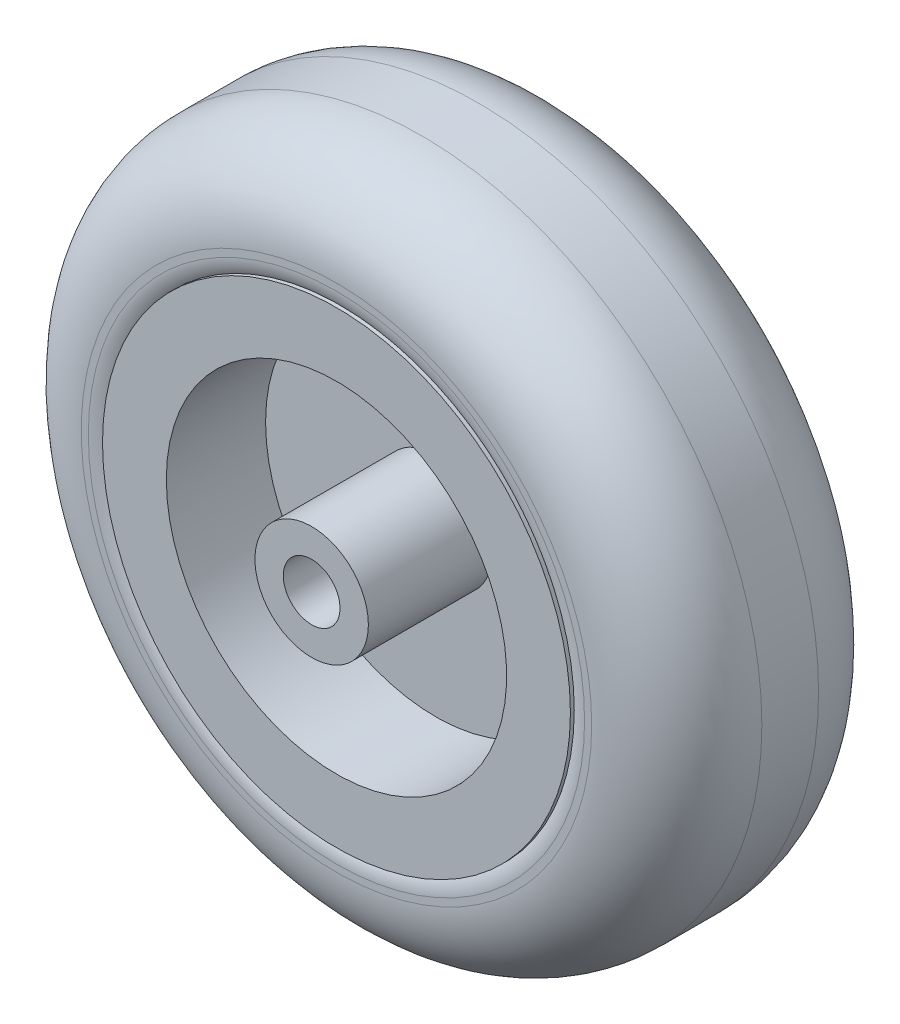
ISO-10303-21;
HEADER;
FILE_DESCRIPTION(('STEP AP214'),'2;1');
FILE_NAME('part.step','',(''),(''),'','','');
FILE_SCHEMA(('AUTOMOTIVE_DESIGN { 1 0 10303 214 1 1 1 1 }'));
ENDSEC;
DATA;
#1=APPLICATION_CONTEXT('core data for automotive mechanical design processes');
#2=APPLICATION_PROTOCOL_DEFINITION('international standard','automotive_design',2000,#1);
#3=PRODUCT_CONTEXT('',#1,'mechanical');
#4=PRODUCT('Part','Part','',(#3));
#5=PRODUCT_RELATED_PRODUCT_CATEGORY('part','',(#4));
#6=PRODUCT_DEFINITION_FORMATION('','',#4);
#7=PRODUCT_DEFINITION_CONTEXT('part definition',#1,'design');
#8=PRODUCT_DEFINITION('design','',#6,#7);
#9=PRODUCT_DEFINITION_SHAPE('','',#8);
#10=(LENGTH_UNIT() NAMED_UNIT(*) SI_UNIT(.MILLI.,.METRE.));
#11=(NAMED_UNIT(*) PLANE_ANGLE_UNIT() SI_UNIT($,.RADIAN.));
#12=(NAMED_UNIT(*) SI_UNIT($,.STERADIAN.) SOLID_ANGLE_UNIT());
#13=UNCERTAINTY_MEASURE_WITH_UNIT(LENGTH_MEASURE(1.E-05),#10,'distance_accuracy_value','');
#14=(GEOMETRIC_REPRESENTATION_CONTEXT(3) GLOBAL_UNCERTAINTY_ASSIGNED_CONTEXT((#13)) GLOBAL_UNIT_ASSIGNED_CONTEXT((#10,
#11,#12)) REPRESENTATION_CONTEXT('',''));
#15=CARTESIAN_POINT('',(0.,0.,0.));
#16=DIRECTION('',(0.,0.,1.));
#17=DIRECTION('',(1.,0.,0.));
#18=AXIS2_PLACEMENT_3D('',#15,#16,#17);
#19=CARTESIAN_POINT('',(0.,0.,25.4));
#20=DIRECTION('',(0.,0.,1.));
#21=DIRECTION('',(1.,0.,0.));
#22=AXIS2_PLACEMENT_3D('',#19,#20,#21);
#23=PLANE('',#22);
#24=CARTESIAN_POINT('',(0.,0.,25.4));
#25=DIRECTION('',(0.,0.,1.));
#26=DIRECTION('',(1.,0.,0.));
#27=AXIS2_PLACEMENT_3D('',#24,#25,#26);
#28=CIRCLE('',#27,52.3875);
#29=CARTESIAN_POINT('',(52.3875,0.,25.4));
#30=VERTEX_POINT('',#29);
#31=EDGE_CURVE('E11',#30,#30,#28,.T.);
#32=ORIENTED_EDGE('',*,*,#31,.T.);
#33=EDGE_LOOP('',(#32));
#34=FACE_BOUND('',#33,.T.);
#35=CARTESIAN_POINT('',(0.,0.,25.4));
#36=DIRECTION('',(0.,0.,-1.));
#37=DIRECTION('',(-1.,0.,0.));
#38=AXIS2_PLACEMENT_3D('',#35,#36,#37);
#39=CIRCLE('',#38,38.1);
#40=CARTESIAN_POINT('',(-38.1,0.,25.4));
#41=VERTEX_POINT('',#40);
#42=EDGE_CURVE('E78',#41,#41,#39,.T.);
#43=ORIENTED_EDGE('',*,*,#42,.T.);
#44=EDGE_LOOP('',(#43));
#45=FACE_BOUND('',#44,.T.);
#46=ADVANCED_FACE('F44',(#34,#45),#23,.T.);
#47=CARTESIAN_POINT('',(0.,0.,25.4));
#48=DIRECTION('',(0.,0.,-1.));
#49=DIRECTION('',(-1.,0.,0.));
#50=AXIS2_PLACEMENT_3D('',#47,#48,#49);
#51=CYLINDRICAL_SURFACE('',#50,52.3875);
#52=ORIENTED_EDGE('',*,*,#31,.F.);
#53=EDGE_LOOP('',(#52));
#54=FACE_BOUND('',#53,.T.);
#55=CARTESIAN_POINT('',(0.,0.,22.225));
#56=DIRECTION('',(0.,0.,1.));
#57=DIRECTION('',(1.,0.,0.));
#58=AXIS2_PLACEMENT_3D('',#55,#56,#57);
#59=CIRCLE('',#58,52.3875);
#60=CARTESIAN_POINT('',(52.3875,0.,22.225));
#61=VERTEX_POINT('',#60);
#62=EDGE_CURVE('E55',#61,#61,#59,.T.);
#63=ORIENTED_EDGE('',*,*,#62,.T.);
#64=EDGE_LOOP('',(#63));
#65=FACE_BOUND('',#64,.T.);
#66=ADVANCED_FACE('F46',(#54,#65),#51,.T.);
#67=CARTESIAN_POINT('',(0.,52.3875,22.225));
#68=DIRECTION('',(0.,0.,-1.));
#69=DIRECTION('',(-1.,0.,0.));
#70=AXIS2_PLACEMENT_3D('',#67,#68,#69);
#71=PLANE('',#70);
#72=CARTESIAN_POINT('',(0.,0.,22.225));
#73=DIRECTION('',(0.,0.,1.));
#74=DIRECTION('',(1.,0.,0.));
#75=AXIS2_PLACEMENT_3D('',#72,#73,#74);
#76=CIRCLE('',#75,44.45);
#77=CARTESIAN_POINT('',(44.45,0.,22.225));
#78=VERTEX_POINT('',#77);
#79=EDGE_CURVE('E59',#78,#78,#76,.T.);
#80=ORIENTED_EDGE('',*,*,#79,.T.);
#81=EDGE_LOOP('',(#80));
#82=FACE_BOUND('',#81,.T.);
#83=ORIENTED_EDGE('',*,*,#62,.F.);
#84=EDGE_LOOP('',(#83));
#85=FACE_BOUND('',#84,.T.);
#86=ADVANCED_FACE('F136',(#82,#85),#71,.T.);
#87=CARTESIAN_POINT('',(0.,0.,0.));
#88=DIRECTION('',(0.,0.,1.));
#89=DIRECTION('',(1.,0.,0.));
#90=AXIS2_PLACEMENT_3D('',#87,#88,#89);
#91=CYLINDRICAL_SURFACE('',#90,44.45);
#92=CARTESIAN_POINT('',(0.,0.,-22.225));
#93=DIRECTION('',(0.,0.,1.));
#94=DIRECTION('',(1.,0.,0.));
#95=AXIS2_PLACEMENT_3D('',#92,#93,#94);
#96=CIRCLE('',#95,44.45);
#97=CARTESIAN_POINT('',(44.45,0.,-22.225));
#98=VERTEX_POINT('',#97);
#99=EDGE_CURVE('E62',#98,#98,#96,.T.);
#100=ORIENTED_EDGE('',*,*,#99,.T.);
#101=EDGE_LOOP('',(#100));
#102=FACE_BOUND('',#101,.T.);
#103=ORIENTED_EDGE('',*,*,#79,.F.);
#104=EDGE_LOOP('',(#103));
#105=FACE_BOUND('',#104,.T.);
#106=ADVANCED_FACE('F151',(#102,#105),#91,.T.);
#107=CARTESIAN_POINT('',(0.,44.45,-22.225));
#108=DIRECTION('',(0.,0.,1.));
#109=DIRECTION('',(1.,0.,0.));
#110=AXIS2_PLACEMENT_3D('',#107,#108,#109);
#111=PLANE('',#110);
#112=CARTESIAN_POINT('',(0.,0.,-22.225));
#113=DIRECTION('',(0.,0.,1.));
#114=DIRECTION('',(1.,0.,0.));
#115=AXIS2_PLACEMENT_3D('',#112,#113,#114);
#116=CIRCLE('',#115,52.3875);
#117=CARTESIAN_POINT('',(52.3875,0.,-22.225));
#118=VERTEX_POINT('',#117);
#119=EDGE_CURVE('E65',#118,#118,#116,.T.);
#120=ORIENTED_EDGE('',*,*,#119,.T.);
#121=EDGE_LOOP('',(#120));
#122=FACE_BOUND('',#121,.T.);
#123=ORIENTED_EDGE('',*,*,#99,.F.);
#124=EDGE_LOOP('',(#123));
#125=FACE_BOUND('',#124,.T.);
#126=ADVANCED_FACE('F144',(#122,#125),#111,.T.);
#127=CARTESIAN_POINT('',(0.,0.,-25.4));
#128=DIRECTION('',(0.,0.,1.));
#129=DIRECTION('',(1.,0.,0.));
#130=AXIS2_PLACEMENT_3D('',#127,#128,#129);
#131=PLANE('',#130);
#132=CARTESIAN_POINT('',(0.,0.,-25.4));
#133=DIRECTION('',(0.,0.,-1.));
#134=DIRECTION('',(-1.,0.,0.));
#135=AXIS2_PLACEMENT_3D('',#132,#133,#134);
#136=CIRCLE('',#135,38.1);
#137=CARTESIAN_POINT('',(-38.1,0.,-25.4));
#138=VERTEX_POINT('',#137);
#139=EDGE_CURVE('E69',#138,#138,#136,.T.);
#140=ORIENTED_EDGE('',*,*,#139,.F.);
#141=EDGE_LOOP('',(#140));
#142=FACE_BOUND('',#141,.T.);
#143=CARTESIAN_POINT('',(0.,0.,-25.4));
#144=DIRECTION('',(0.,0.,1.));
#145=DIRECTION('',(1.,0.,0.));
#146=AXIS2_PLACEMENT_3D('',#143,#144,#145);
#147=CIRCLE('',#146,52.3875);
#148=CARTESIAN_POINT('',(52.3875,0.,-25.4));
#149=VERTEX_POINT('',#148);
#150=EDGE_CURVE('E48',#149,#149,#147,.T.);
#151=ORIENTED_EDGE('',*,*,#150,.F.);
#152=EDGE_LOOP('',(#151));
#153=FACE_BOUND('',#152,.T.);
#154=ADVANCED_FACE('F142',(#142,#153),#131,.F.);
#155=ORIENTED_EDGE('',*,*,#150,.T.);
#156=EDGE_LOOP('',(#155));
#157=FACE_BOUND('',#156,.T.);
#158=ORIENTED_EDGE('',*,*,#119,.F.);
#159=EDGE_LOOP('',(#158));
#160=FACE_BOUND('',#159,.T.);
#161=ADVANCED_FACE('F138',(#157,#160),#51,.T.);
#162=CARTESIAN_POINT('',(0.,0.,-3.175));
#163=DIRECTION('',(0.,0.,-1.));
#164=DIRECTION('',(-1.,0.,0.));
#165=AXIS2_PLACEMENT_3D('',#162,#163,#164);
#166=CYLINDRICAL_SURFACE('',#165,38.1);
#167=CARTESIAN_POINT('',(0.,0.,-3.175));
#168=DIRECTION('',(0.,0.,-1.));
#169=DIRECTION('',(-1.,0.,0.));
#170=AXIS2_PLACEMENT_3D('',#167,#168,#169);
#171=CIRCLE('',#170,38.1);
#172=CARTESIAN_POINT('',(-38.1,0.,-3.175));
#173=VERTEX_POINT('',#172);
#174=EDGE_CURVE('E68',#173,#173,#171,.T.);
#175=ORIENTED_EDGE('',*,*,#174,.F.);
#176=EDGE_LOOP('',(#175));
#177=FACE_BOUND('',#176,.T.);
#178=ORIENTED_EDGE('',*,*,#139,.T.);
#179=EDGE_LOOP('',(#178));
#180=FACE_BOUND('',#179,.T.);
#181=ADVANCED_FACE('F127',(#177,#180),#166,.F.);
#182=CARTESIAN_POINT('',(0.,0.,-3.175));
#183=DIRECTION('',(0.,0.,-1.));
#184=DIRECTION('',(-1.,0.,0.));
#185=AXIS2_PLACEMENT_3D('',#182,#183,#184);
#186=PLANE('',#185);
#187=CARTESIAN_POINT('',(0.,0.,-3.175));
#188=DIRECTION('',(0.,0.,-1.));
#189=DIRECTION('',(-1.,0.,0.));
#190=AXIS2_PLACEMENT_3D('',#187,#188,#189);
#191=CIRCLE('',#190,12.7);
#192=CARTESIAN_POINT('',(-12.7,0.,-3.175));
#193=VERTEX_POINT('',#192);
#194=EDGE_CURVE('E72',#193,#193,#191,.T.);
#195=ORIENTED_EDGE('',*,*,#194,.F.);
#196=EDGE_LOOP('',(#195));
#197=FACE_BOUND('',#196,.T.);
#198=ORIENTED_EDGE('',*,*,#174,.T.);
#199=EDGE_LOOP('',(#198));
#200=FACE_BOUND('',#199,.T.);
#201=ADVANCED_FACE('F117',(#197,#200),#186,.T.);
#202=CARTESIAN_POINT('',(0.,0.,-3.175));
#203=DIRECTION('',(0.,0.,-1.));
#204=DIRECTION('',(-1.,0.,0.));
#205=AXIS2_PLACEMENT_3D('',#202,#203,#204);
#206=CYLINDRICAL_SURFACE('',#205,12.7);
#207=ORIENTED_EDGE('',*,*,#194,.T.);
#208=EDGE_LOOP('',(#207));
#209=FACE_BOUND('',#208,.T.);
#210=CARTESIAN_POINT('',(0.,0.,-30.95625));
#211=DIRECTION('',(0.,0.,1.));
#212=DIRECTION('',(1.,0.,0.));
#213=AXIS2_PLACEMENT_3D('',#210,#211,#212);
#214=CIRCLE('',#213,12.7);
#215=CARTESIAN_POINT('',(12.7,0.,-30.95625));
#216=VERTEX_POINT('',#215);
#217=EDGE_CURVE('E87',#216,#216,#214,.T.);
#218=ORIENTED_EDGE('',*,*,#217,.T.);
#219=EDGE_LOOP('',(#218));
#220=FACE_BOUND('',#219,.T.);
#221=ADVANCED_FACE('F114',(#209,#220),#206,.T.);
#222=CARTESIAN_POINT('',(0.,0.,3.175));
#223=DIRECTION('',(0.,0.,1.));
#224=DIRECTION('',(-1.,0.,0.));
#225=AXIS2_PLACEMENT_3D('',#222,#223,#224);
#226=PLANE('',#225);
#227=CARTESIAN_POINT('',(0.,0.,3.175));
#228=DIRECTION('',(0.,0.,-1.));
#229=DIRECTION('',(-1.,0.,0.));
#230=AXIS2_PLACEMENT_3D('',#227,#228,#229);
#231=CIRCLE('',#230,38.1);
#232=CARTESIAN_POINT('',(-38.1,0.,3.175));
#233=VERTEX_POINT('',#232);
#234=EDGE_CURVE('E77',#233,#233,#231,.T.);
#235=ORIENTED_EDGE('',*,*,#234,.F.);
#236=EDGE_LOOP('',(#235));
#237=FACE_BOUND('',#236,.T.);
#238=CARTESIAN_POINT('',(0.,0.,3.175));
#239=DIRECTION('',(0.,0.,-1.));
#240=DIRECTION('',(-1.,0.,0.));
#241=AXIS2_PLACEMENT_3D('',#238,#239,#240);
#242=CIRCLE('',#241,12.7);
#243=CARTESIAN_POINT('',(-12.7,0.,3.175));
#244=VERTEX_POINT('',#243);
#245=EDGE_CURVE('E81',#244,#244,#242,.T.);
#246=ORIENTED_EDGE('',*,*,#245,.T.);
#247=EDGE_LOOP('',(#246));
#248=FACE_BOUND('',#247,.T.);
#249=ADVANCED_FACE('F116',(#237,#248),#226,.T.);
#250=CARTESIAN_POINT('',(0.,0.,3.175));
#251=DIRECTION('',(0.,0.,1.));
#252=DIRECTION('',(1.,0.,0.));
#253=AXIS2_PLACEMENT_3D('',#250,#251,#252);
#254=CYLINDRICAL_SURFACE('',#253,38.1);
#255=ORIENTED_EDGE('',*,*,#234,.T.);
#256=EDGE_LOOP('',(#255));
#257=FACE_BOUND('',#256,.T.);
#258=ORIENTED_EDGE('',*,*,#42,.F.);
#259=EDGE_LOOP('',(#258));
#260=FACE_BOUND('',#259,.T.);
#261=ADVANCED_FACE('F124',(#257,#260),#254,.F.);
#262=CARTESIAN_POINT('',(0.,0.,3.175));
#263=DIRECTION('',(0.,0.,1.));
#264=DIRECTION('',(1.,0.,0.));
#265=AXIS2_PLACEMENT_3D('',#262,#263,#264);
#266=CYLINDRICAL_SURFACE('',#265,12.7);
#267=ORIENTED_EDGE('',*,*,#245,.F.);
#268=EDGE_LOOP('',(#267));
#269=FACE_BOUND('',#268,.T.);
#270=CARTESIAN_POINT('',(0.,0.,30.95625));
#271=DIRECTION('',(0.,0.,1.));
#272=DIRECTION('',(1.,0.,0.));
#273=AXIS2_PLACEMENT_3D('',#270,#271,#272);
#274=CIRCLE('',#273,12.7);
#275=CARTESIAN_POINT('',(12.7,0.,30.95625));
#276=VERTEX_POINT('',#275);
#277=EDGE_CURVE('E86',#276,#276,#274,.T.);
#278=ORIENTED_EDGE('',*,*,#277,.F.);
#279=EDGE_LOOP('',(#278));
#280=FACE_BOUND('',#279,.T.);
#281=ADVANCED_FACE('F227',(#269,#280),#266,.T.);
#282=CARTESIAN_POINT('',(0.,0.,30.95625));
#283=DIRECTION('',(0.,0.,1.));
#284=DIRECTION('',(1.,0.,0.));
#285=AXIS2_PLACEMENT_3D('',#282,#283,#284);
#286=PLANE('',#285);
#287=CARTESIAN_POINT('',(0.,0.,30.95625));
#288=DIRECTION('',(0.,0.,-1.));
#289=DIRECTION('',(-1.,0.,0.));
#290=AXIS2_PLACEMENT_3D('',#287,#288,#289);
#291=CIRCLE('',#290,6.35);
#292=CARTESIAN_POINT('',(-6.35,0.,30.95625));
#293=VERTEX_POINT('',#292);
#294=EDGE_CURVE('E90',#293,#293,#291,.T.);
#295=ORIENTED_EDGE('',*,*,#294,.T.);
#296=EDGE_LOOP('',(#295));
#297=FACE_BOUND('',#296,.T.);
#298=ORIENTED_EDGE('',*,*,#277,.T.);
#299=EDGE_LOOP('',(#298));
#300=FACE_BOUND('',#299,.T.);
#301=ADVANCED_FACE('F99',(#297,#300),#286,.T.);
#302=CARTESIAN_POINT('',(0.,0.,-30.95625));
#303=DIRECTION('',(0.,0.,1.));
#304=DIRECTION('',(1.,0.,0.));
#305=AXIS2_PLACEMENT_3D('',#302,#303,#304);
#306=PLANE('',#305);
#307=CARTESIAN_POINT('',(0.,0.,-30.95625));
#308=DIRECTION('',(0.,0.,-1.));
#309=DIRECTION('',(-1.,0.,0.));
#310=AXIS2_PLACEMENT_3D('',#307,#308,#309);
#311=CIRCLE('',#310,6.35);
#312=CARTESIAN_POINT('',(-6.35,0.,-30.95625));
#313=VERTEX_POINT('',#312);
#314=EDGE_CURVE('E93',#313,#313,#311,.T.);
#315=ORIENTED_EDGE('',*,*,#314,.F.);
#316=EDGE_LOOP('',(#315));
#317=FACE_BOUND('',#316,.T.);
#318=ORIENTED_EDGE('',*,*,#217,.F.);
#319=EDGE_LOOP('',(#318));
#320=FACE_BOUND('',#319,.T.);
#321=ADVANCED_FACE('F105',(#317,#320),#306,.F.);
#322=CARTESIAN_POINT('',(0.,0.,30.95625));
#323=DIRECTION('',(0.,0.,-1.));
#324=DIRECTION('',(-1.,0.,0.));
#325=AXIS2_PLACEMENT_3D('',#322,#323,#324);
#326=CYLINDRICAL_SURFACE('',#325,6.35);
#327=ORIENTED_EDGE('',*,*,#294,.F.);
#328=EDGE_LOOP('',(#327));
#329=FACE_BOUND('',#328,.T.);
#330=ORIENTED_EDGE('',*,*,#314,.T.);
#331=EDGE_LOOP('',(#330));
#332=FACE_BOUND('',#331,.T.);
#333=ADVANCED_FACE('F102',(#329,#332),#326,.F.);
#334=CLOSED_SHELL('',(#46,#66,#86,#106,#126,#154,#161,#181,#201,#221,#249,#261,#281,#301,#321,#333));
#335=MANIFOLD_SOLID_BREP('B2',#334);
#336=CARTESIAN_POINT('',(0.,0.,25.4));
#337=DIRECTION('',(0.,0.,1.));
#338=DIRECTION('',(1.,0.,0.));
#339=AXIS2_PLACEMENT_3D('',#336,#337,#338);
#340=PLANE('',#339);
#341=CARTESIAN_POINT('',(0.,0.,25.4));
#342=DIRECTION('',(0.,0.,1.));
#343=DIRECTION('',(1.,0.,0.));
#344=AXIS2_PLACEMENT_3D('',#341,#342,#343);
#345=CIRCLE('',#344,55.5625);
#346=CARTESIAN_POINT('',(55.5625,0.,25.4));
#347=VERTEX_POINT('',#346);
#348=EDGE_CURVE('E43',#347,#347,#345,.F.);
#349=ORIENTED_EDGE('',*,*,#348,.T.);
#350=EDGE_LOOP('',(#349));
#351=FACE_BOUND('',#350,.T.);
#352=CARTESIAN_POINT('',(0.,0.,25.4));
#353=DIRECTION('',(0.,0.,1.));
#354=DIRECTION('',(1.,0.,0.));
#355=AXIS2_PLACEMENT_3D('',#352,#353,#354);
#356=CIRCLE('',#355,57.15);
#357=CARTESIAN_POINT('',(57.15,0.,25.4));
#358=VERTEX_POINT('',#357);
#359=EDGE_CURVE('E310',#358,#358,#356,.T.);
#360=ORIENTED_EDGE('',*,*,#359,.T.);
#361=EDGE_LOOP('',(#360));
#362=FACE_BOUND('',#361,.T.);
#363=ADVANCED_FACE('F290',(#351,#362),#340,.T.);
#364=CARTESIAN_POINT('',(0.,0.,-25.4));
#365=DIRECTION('',(0.,0.,1.));
#366=DIRECTION('',(1.,0.,0.));
#367=AXIS2_PLACEMENT_3D('',#364,#365,#366);
#368=PLANE('',#367);
#369=CARTESIAN_POINT('',(0.,0.,-25.4));
#370=DIRECTION('',(0.,0.,1.));
#371=DIRECTION('',(1.,0.,0.));
#372=AXIS2_PLACEMENT_3D('',#369,#370,#371);
#373=CIRCLE('',#372,55.5625);
#374=CARTESIAN_POINT('',(55.5625,0.,-25.4));
#375=VERTEX_POINT('',#374);
#376=EDGE_CURVE('E305',#375,#375,#373,.T.);
#377=ORIENTED_EDGE('',*,*,#376,.T.);
#378=EDGE_LOOP('',(#377));
#379=FACE_BOUND('',#378,.T.);
#380=CARTESIAN_POINT('',(0.,0.,-25.4));
#381=DIRECTION('',(0.,0.,1.));
#382=DIRECTION('',(1.,0.,0.));
#383=AXIS2_PLACEMENT_3D('',#380,#381,#382);
#384=CIRCLE('',#383,57.15);
#385=CARTESIAN_POINT('',(57.15,0.,-25.4));
#386=VERTEX_POINT('',#385);
#387=EDGE_CURVE('E313',#386,#386,#384,.F.);
#388=ORIENTED_EDGE('',*,*,#387,.T.);
#389=EDGE_LOOP('',(#388));
#390=FACE_BOUND('',#389,.T.);
#391=ADVANCED_FACE('F334',(#379,#390),#368,.F.);
#392=CARTESIAN_POINT('',(0.,0.,25.4));
#393=DIRECTION('',(0.,0.,-1.));
#394=DIRECTION('',(-1.,0.,0.));
#395=AXIS2_PLACEMENT_3D('',#392,#393,#394);
#396=CYLINDRICAL_SURFACE('',#395,76.2);
#397=CARTESIAN_POINT('',(0.,0.,-6.35));
#398=DIRECTION('',(0.,0.,1.));
#399=DIRECTION('',(1.,0.,0.));
#400=AXIS2_PLACEMENT_3D('',#397,#398,#399);
#401=CIRCLE('',#400,76.2);
#402=CARTESIAN_POINT('',(76.2,0.,-6.35));
#403=VERTEX_POINT('',#402);
#404=EDGE_CURVE('E316',#403,#403,#401,.T.);
#405=ORIENTED_EDGE('',*,*,#404,.T.);
#406=EDGE_LOOP('',(#405));
#407=FACE_BOUND('',#406,.T.);
#408=CARTESIAN_POINT('',(0.,0.,6.35));
#409=DIRECTION('',(0.,0.,1.));
#410=DIRECTION('',(1.,0.,0.));
#411=AXIS2_PLACEMENT_3D('',#408,#409,#410);
#412=CIRCLE('',#411,76.2);
#413=CARTESIAN_POINT('',(76.2,0.,6.35));
#414=VERTEX_POINT('',#413);
#415=EDGE_CURVE('E319',#414,#414,#412,.F.);
#416=ORIENTED_EDGE('',*,*,#415,.T.);
#417=EDGE_LOOP('',(#416));
#418=FACE_BOUND('',#417,.T.);
#419=ADVANCED_FACE('F323',(#407,#418),#396,.T.);
#420=CARTESIAN_POINT('',(0.,0.,25.4));
#421=DIRECTION('',(0.,0.,-1.));
#422=DIRECTION('',(-1.,0.,0.));
#423=AXIS2_PLACEMENT_3D('',#420,#421,#422);
#424=CYLINDRICAL_SURFACE('',#423,49.2125);
#425=CARTESIAN_POINT('',(0.,0.,-19.05));
#426=DIRECTION('',(0.,0.,1.));
#427=DIRECTION('',(1.,0.,0.));
#428=AXIS2_PLACEMENT_3D('',#425,#426,#427);
#429=CIRCLE('',#428,49.2125);
#430=CARTESIAN_POINT('',(49.2125,0.,-19.05));
#431=VERTEX_POINT('',#430);
#432=EDGE_CURVE('E297',#431,#431,#429,.F.);
#433=ORIENTED_EDGE('',*,*,#432,.T.);
#434=EDGE_LOOP('',(#433));
#435=FACE_BOUND('',#434,.T.);
#436=CARTESIAN_POINT('',(0.,0.,19.05));
#437=DIRECTION('',(0.,0.,1.));
#438=DIRECTION('',(1.,0.,0.));
#439=AXIS2_PLACEMENT_3D('',#436,#437,#438);
#440=CIRCLE('',#439,49.2125);
#441=CARTESIAN_POINT('',(49.2125,0.,19.05));
#442=VERTEX_POINT('',#441);
#443=EDGE_CURVE('E301',#442,#442,#440,.T.);
#444=ORIENTED_EDGE('',*,*,#443,.T.);
#445=EDGE_LOOP('',(#444));
#446=FACE_BOUND('',#445,.T.);
#447=ADVANCED_FACE('F342',(#435,#446),#424,.F.);
#448=CARTESIAN_POINT('',(0.,0.,-6.35));
#449=DIRECTION('',(0.,0.,1.));
#450=DIRECTION('',(1.,0.,0.));
#451=AXIS2_PLACEMENT_3D('',#448,#449,#450);
#452=TOROIDAL_SURFACE('',#451,57.15,19.05);
#453=ORIENTED_EDGE('',*,*,#387,.F.);
#454=EDGE_LOOP('',(#453));
#455=FACE_BOUND('',#454,.T.);
#456=ORIENTED_EDGE('',*,*,#404,.F.);
#457=EDGE_LOOP('',(#456));
#458=FACE_BOUND('',#457,.T.);
#459=ADVANCED_FACE('F329',(#455,#458),#452,.T.);
#460=CARTESIAN_POINT('',(0.,0.,6.35));
#461=DIRECTION('',(0.,0.,1.));
#462=DIRECTION('',(1.,0.,0.));
#463=AXIS2_PLACEMENT_3D('',#460,#461,#462);
#464=TOROIDAL_SURFACE('',#463,57.15,19.05);
#465=ORIENTED_EDGE('',*,*,#415,.F.);
#466=EDGE_LOOP('',(#465));
#467=FACE_BOUND('',#466,.T.);
#468=ORIENTED_EDGE('',*,*,#359,.F.);
#469=EDGE_LOOP('',(#468));
#470=FACE_BOUND('',#469,.T.);
#471=ADVANCED_FACE('F325',(#467,#470),#464,.T.);
#472=CARTESIAN_POINT('',(0.,0.,-19.05));
#473=DIRECTION('',(0.,0.,1.));
#474=DIRECTION('',(1.,0.,0.));
#475=AXIS2_PLACEMENT_3D('',#472,#473,#474);
#476=TOROIDAL_SURFACE('',#475,55.5625,6.35);
#477=ORIENTED_EDGE('',*,*,#432,.F.);
#478=EDGE_LOOP('',(#477));
#479=FACE_BOUND('',#478,.T.);
#480=ORIENTED_EDGE('',*,*,#376,.F.);
#481=EDGE_LOOP('',(#480));
#482=FACE_BOUND('',#481,.T.);
#483=ADVANCED_FACE('F328',(#479,#482),#476,.T.);
#484=CARTESIAN_POINT('',(0.,0.,19.05));
#485=DIRECTION('',(0.,0.,1.));
#486=DIRECTION('',(1.,0.,0.));
#487=AXIS2_PLACEMENT_3D('',#484,#485,#486);
#488=TOROIDAL_SURFACE('',#487,55.5625,6.35);
#489=ORIENTED_EDGE('',*,*,#348,.F.);
#490=EDGE_LOOP('',(#489));
#491=FACE_BOUND('',#490,.T.);
#492=ORIENTED_EDGE('',*,*,#443,.F.);
#493=EDGE_LOOP('',(#492));
#494=FACE_BOUND('',#493,.T.);
#495=ADVANCED_FACE('F292',(#491,#494),#488,.T.);
#496=CLOSED_SHELL('',(#363,#391,#419,#447,#459,#471,#483,#495));
#497=MANIFOLD_SOLID_BREP('B6',#496);
#498=ADVANCED_BREP_SHAPE_REPRESENTATION('',(#18,#335,#497),#14);
#499=SHAPE_DEFINITION_REPRESENTATION(#9,#498);
ENDSEC;
END-ISO-10303-21;
